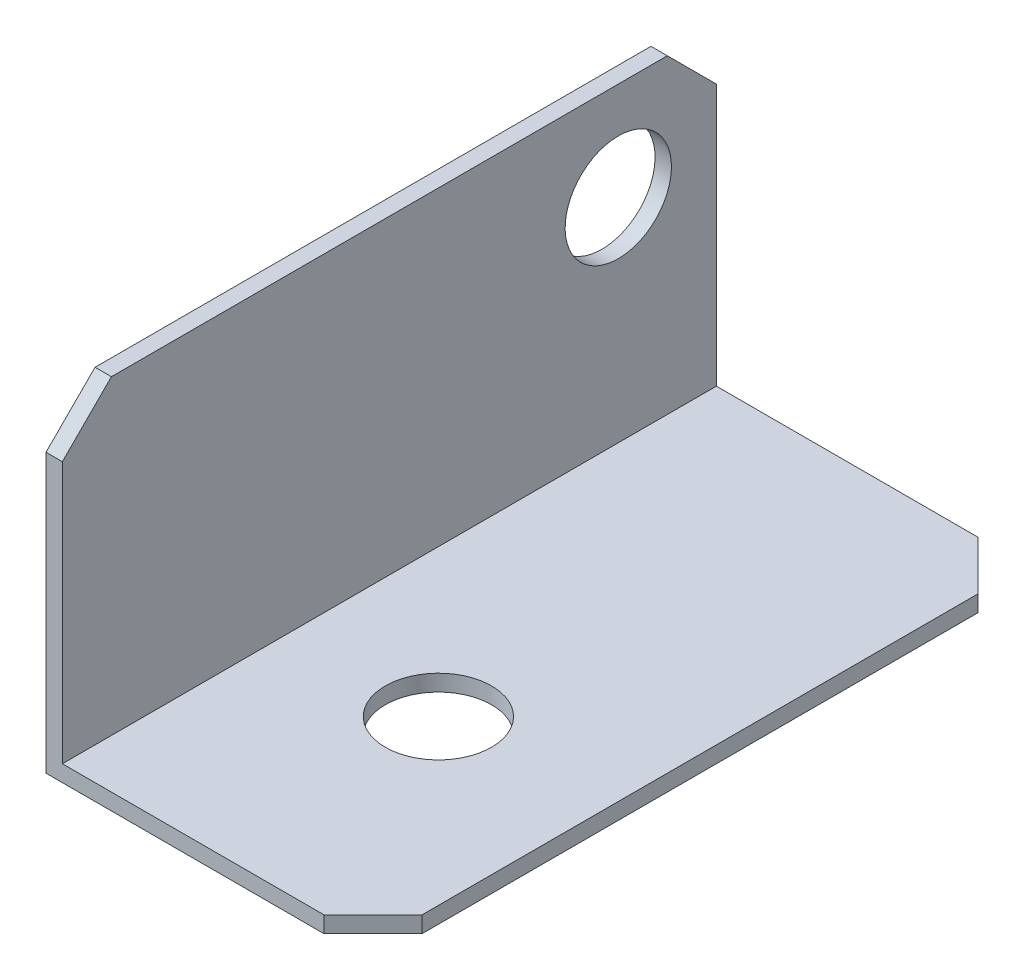
ISO-10303-21;
HEADER;
FILE_DESCRIPTION(('STEP AP214'),'2;1');
FILE_NAME('part.step','',(''),(''),'','','');
FILE_SCHEMA(('AUTOMOTIVE_DESIGN { 1 0 10303 214 1 1 1 1 }'));
ENDSEC;
DATA;
#1=APPLICATION_CONTEXT('core data for automotive mechanical design processes');
#2=APPLICATION_PROTOCOL_DEFINITION('international standard','automotive_design',2000,#1);
#3=PRODUCT_CONTEXT('',#1,'mechanical');
#4=PRODUCT('Part','Part','',(#3));
#5=PRODUCT_RELATED_PRODUCT_CATEGORY('part','',(#4));
#6=PRODUCT_DEFINITION_FORMATION('','',#4);
#7=PRODUCT_DEFINITION_CONTEXT('part definition',#1,'design');
#8=PRODUCT_DEFINITION('design','',#6,#7);
#9=PRODUCT_DEFINITION_SHAPE('','',#8);
#10=(LENGTH_UNIT() NAMED_UNIT(*) SI_UNIT(.MILLI.,.METRE.));
#11=(NAMED_UNIT(*) PLANE_ANGLE_UNIT() SI_UNIT($,.RADIAN.));
#12=(NAMED_UNIT(*) SI_UNIT($,.STERADIAN.) SOLID_ANGLE_UNIT());
#13=UNCERTAINTY_MEASURE_WITH_UNIT(LENGTH_MEASURE(1.E-05),#10,'distance_accuracy_value','');
#14=(GEOMETRIC_REPRESENTATION_CONTEXT(3) GLOBAL_UNCERTAINTY_ASSIGNED_CONTEXT((#13)) GLOBAL_UNIT_ASSIGNED_CONTEXT((#10,
#11,#12)) REPRESENTATION_CONTEXT('',''));
#15=CARTESIAN_POINT('',(0.,0.,0.));
#16=DIRECTION('',(0.,0.,1.));
#17=DIRECTION('',(1.,0.,0.));
#18=AXIS2_PLACEMENT_3D('',#15,#16,#17);
#19=CARTESIAN_POINT('',(0.,0.,20.));
#20=DIRECTION('',(0.,1.,0.));
#21=DIRECTION('',(0.,0.,1.));
#22=AXIS2_PLACEMENT_3D('',#19,#20,#21);
#23=PLANE('',#22);
#24=CARTESIAN_POINT('',(10.,0.,6.));
#25=DIRECTION('',(0.,1.,0.));
#26=DIRECTION('',(0.,0.,1.));
#27=AXIS2_PLACEMENT_3D('',#24,#25,#26);
#28=CIRCLE('',#27,3.25);
#29=CARTESIAN_POINT('',(10.,0.,9.25));
#30=VERTEX_POINT('',#29);
#31=EDGE_CURVE('E149',#30,#30,#28,.T.);
#32=ORIENTED_EDGE('',*,*,#31,.T.);
#33=EDGE_LOOP('',(#32));
#34=FACE_BOUND('',#33,.T.);
#35=DIRECTION('',(0.,0.,-1.));
#36=VECTOR('',#35,1.);
#37=CARTESIAN_POINT('',(20.,0.,20.));
#38=LINE('',#37,#36);
#39=CARTESIAN_POINT('',(20.,0.,17.));
#40=VERTEX_POINT('',#39);
#41=CARTESIAN_POINT('',(20.,0.,-17.));
#42=VERTEX_POINT('',#41);
#43=EDGE_CURVE('E161',#40,#42,#38,.T.);
#44=ORIENTED_EDGE('',*,*,#43,.F.);
#45=DIRECTION('',(-0.707106781186549,0.,0.707106781186546));
#46=VECTOR('',#45,1.);
#47=CARTESIAN_POINT('',(20.,0.,17.));
#48=LINE('',#47,#46);
#49=CARTESIAN_POINT('',(17.,0.,20.));
#50=VERTEX_POINT('',#49);
#51=EDGE_CURVE('E171',#40,#50,#48,.T.);
#52=ORIENTED_EDGE('',*,*,#51,.T.);
#53=DIRECTION('',(1.,0.,0.));
#54=VECTOR('',#53,1.);
#55=CARTESIAN_POINT('',(0.,0.,20.));
#56=LINE('',#55,#54);
#57=CARTESIAN_POINT('',(0.,0.,20.));
#58=VERTEX_POINT('',#57);
#59=EDGE_CURVE('E138',#58,#50,#56,.T.);
#60=ORIENTED_EDGE('',*,*,#59,.F.);
#61=DIRECTION('',(0.,0.,-1.));
#62=VECTOR('',#61,1.);
#63=CARTESIAN_POINT('',(0.,0.,20.));
#64=LINE('',#63,#62);
#65=CARTESIAN_POINT('',(0.,0.,-20.));
#66=VERTEX_POINT('',#65);
#67=EDGE_CURVE('E145',#58,#66,#64,.T.);
#68=ORIENTED_EDGE('',*,*,#67,.T.);
#69=DIRECTION('',(1.,0.,0.));
#70=VECTOR('',#69,1.);
#71=CARTESIAN_POINT('',(0.,0.,-20.));
#72=LINE('',#71,#70);
#73=CARTESIAN_POINT('',(17.,0.,-20.));
#74=VERTEX_POINT('',#73);
#75=EDGE_CURVE('E146',#66,#74,#72,.T.);
#76=ORIENTED_EDGE('',*,*,#75,.T.);
#77=DIRECTION('',(-0.707106781186546,0.,-0.707106781186549));
#78=VECTOR('',#77,1.);
#79=CARTESIAN_POINT('',(17.,0.,-20.));
#80=LINE('',#79,#78);
#81=EDGE_CURVE('E169',#74,#42,#80,.F.);
#82=ORIENTED_EDGE('',*,*,#81,.T.);
#83=EDGE_LOOP('',(#44,#52,#60,#68,#76,#82));
#84=FACE_BOUND('',#83,.T.);
#85=ADVANCED_FACE('F33',(#34,#84),#23,.F.);
#86=CARTESIAN_POINT('',(20.,1.,20.));
#87=DIRECTION('',(1.,0.,0.));
#88=DIRECTION('',(0.,0.,-1.));
#89=AXIS2_PLACEMENT_3D('',#86,#87,#88);
#90=PLANE('',#89);
#91=DIRECTION('',(0.,0.,-1.));
#92=VECTOR('',#91,1.);
#93=CARTESIAN_POINT('',(20.,1.,20.));
#94=LINE('',#93,#92);
#95=CARTESIAN_POINT('',(20.,1.,17.));
#96=VERTEX_POINT('',#95);
#97=CARTESIAN_POINT('',(20.,1.,-17.));
#98=VERTEX_POINT('',#97);
#99=EDGE_CURVE('E131',#96,#98,#94,.T.);
#100=ORIENTED_EDGE('',*,*,#99,.F.);
#101=DIRECTION('',(0.,-1.,0.));
#102=VECTOR('',#101,1.);
#103=CARTESIAN_POINT('',(20.,0.,17.));
#104=LINE('',#103,#102);
#105=EDGE_CURVE('E166',#96,#40,#104,.T.);
#106=ORIENTED_EDGE('',*,*,#105,.T.);
#107=ORIENTED_EDGE('',*,*,#43,.T.);
#108=DIRECTION('',(0.,1.,0.));
#109=VECTOR('',#108,1.);
#110=CARTESIAN_POINT('',(20.,1.,-17.));
#111=LINE('',#110,#109);
#112=EDGE_CURVE('E164',#42,#98,#111,.T.);
#113=ORIENTED_EDGE('',*,*,#112,.T.);
#114=EDGE_LOOP('',(#100,#106,#107,#113));
#115=FACE_BOUND('',#114,.T.);
#116=ADVANCED_FACE('F215',(#115),#90,.T.);
#117=CARTESIAN_POINT('',(0.,1.,20.));
#118=DIRECTION('',(0.,1.,0.));
#119=DIRECTION('',(0.,0.,1.));
#120=AXIS2_PLACEMENT_3D('',#117,#118,#119);
#121=PLANE('',#120);
#122=CARTESIAN_POINT('',(10.,1.,6.));
#123=DIRECTION('',(0.,1.,0.));
#124=DIRECTION('',(0.,0.,1.));
#125=AXIS2_PLACEMENT_3D('',#122,#123,#124);
#126=CIRCLE('',#125,3.25);
#127=CARTESIAN_POINT('',(10.,1.,9.25));
#128=VERTEX_POINT('',#127);
#129=EDGE_CURVE('E266',#128,#128,#126,.T.);
#130=ORIENTED_EDGE('',*,*,#129,.F.);
#131=EDGE_LOOP('',(#130));
#132=FACE_BOUND('',#131,.T.);
#133=DIRECTION('',(1.,0.,0.));
#134=VECTOR('',#133,1.);
#135=CARTESIAN_POINT('',(0.,1.,20.));
#136=LINE('',#135,#134);
#137=CARTESIAN_POINT('',(1.,1.,20.));
#138=VERTEX_POINT('',#137);
#139=CARTESIAN_POINT('',(17.,1.,20.));
#140=VERTEX_POINT('',#139);
#141=EDGE_CURVE('E123',#138,#140,#136,.T.);
#142=ORIENTED_EDGE('',*,*,#141,.T.);
#143=DIRECTION('',(0.707106781186549,0.,-0.707106781186546));
#144=VECTOR('',#143,1.);
#145=CARTESIAN_POINT('',(8.49999999999995,1.,28.5));
#146=LINE('',#145,#144);
#147=EDGE_CURVE('E178',#140,#96,#146,.T.);
#148=ORIENTED_EDGE('',*,*,#147,.T.);
#149=ORIENTED_EDGE('',*,*,#99,.T.);
#150=DIRECTION('',(0.707106781186546,0.,0.707106781186549));
#151=VECTOR('',#150,1.);
#152=CARTESIAN_POINT('',(28.5,1.,-8.49999999999991));
#153=LINE('',#152,#151);
#154=CARTESIAN_POINT('',(17.,1.,-20.));
#155=VERTEX_POINT('',#154);
#156=EDGE_CURVE('E176',#98,#155,#153,.F.);
#157=ORIENTED_EDGE('',*,*,#156,.T.);
#158=DIRECTION('',(1.,0.,0.));
#159=VECTOR('',#158,1.);
#160=CARTESIAN_POINT('',(0.,1.,-20.));
#161=LINE('',#160,#159);
#162=CARTESIAN_POINT('',(1.,1.,-20.));
#163=VERTEX_POINT('',#162);
#164=EDGE_CURVE('E130',#163,#155,#161,.T.);
#165=ORIENTED_EDGE('',*,*,#164,.F.);
#166=DIRECTION('',(0.,0.,-1.));
#167=VECTOR('',#166,1.);
#168=CARTESIAN_POINT('',(1.,1.,20.));
#169=LINE('',#168,#167);
#170=EDGE_CURVE('E115',#138,#163,#169,.T.);
#171=ORIENTED_EDGE('',*,*,#170,.F.);
#172=EDGE_LOOP('',(#142,#148,#149,#157,#165,#171));
#173=FACE_BOUND('',#172,.T.);
#174=ADVANCED_FACE('F127',(#132,#173),#121,.T.);
#175=CARTESIAN_POINT('',(0.999999999999999,20.,20.));
#176=DIRECTION('',(1.,0.,0.));
#177=DIRECTION('',(0.,1.,0.));
#178=AXIS2_PLACEMENT_3D('',#175,#176,#177);
#179=PLANE('',#178);
#180=CARTESIAN_POINT('',(0.999999999999999,14.,-14.));
#181=DIRECTION('',(1.,0.,0.));
#182=DIRECTION('',(0.,1.,0.));
#183=AXIS2_PLACEMENT_3D('',#180,#181,#182);
#184=CIRCLE('',#183,3.25);
#185=CARTESIAN_POINT('',(0.999999999999999,17.25,-14.));
#186=VERTEX_POINT('',#185);
#187=EDGE_CURVE('E263',#186,#186,#184,.T.);
#188=ORIENTED_EDGE('',*,*,#187,.F.);
#189=EDGE_LOOP('',(#188));
#190=FACE_BOUND('',#189,.T.);
#191=DIRECTION('',(0.,-1.,0.));
#192=VECTOR('',#191,1.);
#193=CARTESIAN_POINT('',(0.999999999999999,20.,-20.));
#194=LINE('',#193,#192);
#195=CARTESIAN_POINT('',(0.999999999999999,17.,-20.));
#196=VERTEX_POINT('',#195);
#197=EDGE_CURVE('E151',#196,#163,#194,.T.);
#198=ORIENTED_EDGE('',*,*,#197,.F.);
#199=DIRECTION('',(0.,-0.707106781186546,-0.707106781186549));
#200=VECTOR('',#199,1.);
#201=CARTESIAN_POINT('',(0.999999999999998,38.5,1.5000000000001));
#202=LINE('',#201,#200);
#203=CARTESIAN_POINT('',(0.999999999999999,20.,-17.));
#204=VERTEX_POINT('',#203);
#205=EDGE_CURVE('E187',#196,#204,#202,.F.);
#206=ORIENTED_EDGE('',*,*,#205,.T.);
#207=DIRECTION('',(0.,0.,-1.));
#208=VECTOR('',#207,1.);
#209=CARTESIAN_POINT('',(0.999999999999999,20.,20.));
#210=LINE('',#209,#208);
#211=CARTESIAN_POINT('',(0.999999999999999,20.,17.));
#212=VERTEX_POINT('',#211);
#213=EDGE_CURVE('E132',#212,#204,#210,.T.);
#214=ORIENTED_EDGE('',*,*,#213,.F.);
#215=DIRECTION('',(0.,-0.707106781186549,0.707106781186546));
#216=VECTOR('',#215,1.);
#217=CARTESIAN_POINT('',(0.999999999999999,18.5,18.5));
#218=LINE('',#217,#216);
#219=CARTESIAN_POINT('',(0.999999999999999,17.,20.));
#220=VERTEX_POINT('',#219);
#221=EDGE_CURVE('E118',#212,#220,#218,.T.);
#222=ORIENTED_EDGE('',*,*,#221,.T.);
#223=DIRECTION('',(0.,-1.,0.));
#224=VECTOR('',#223,1.);
#225=CARTESIAN_POINT('',(0.999999999999999,20.,20.));
#226=LINE('',#225,#224);
#227=EDGE_CURVE('E111',#220,#138,#226,.T.);
#228=ORIENTED_EDGE('',*,*,#227,.T.);
#229=ORIENTED_EDGE('',*,*,#170,.T.);
#230=EDGE_LOOP('',(#198,#206,#214,#222,#228,#229));
#231=FACE_BOUND('',#230,.T.);
#232=ADVANCED_FACE('F114',(#190,#231),#179,.T.);
#233=CARTESIAN_POINT('',(0.,20.,20.));
#234=DIRECTION('',(0.,1.,0.));
#235=DIRECTION('',(0.,0.,1.));
#236=AXIS2_PLACEMENT_3D('',#233,#234,#235);
#237=PLANE('',#236);
#238=ORIENTED_EDGE('',*,*,#213,.T.);
#239=DIRECTION('',(-1.,0.,0.));
#240=VECTOR('',#239,1.);
#241=CARTESIAN_POINT('',(0.,20.,-17.));
#242=LINE('',#241,#240);
#243=CARTESIAN_POINT('',(0.,20.,-17.));
#244=VERTEX_POINT('',#243);
#245=EDGE_CURVE('E49',#204,#244,#242,.T.);
#246=ORIENTED_EDGE('',*,*,#245,.T.);
#247=DIRECTION('',(0.,0.,-1.));
#248=VECTOR('',#247,1.);
#249=CARTESIAN_POINT('',(0.,20.,20.));
#250=LINE('',#249,#248);
#251=CARTESIAN_POINT('',(0.,20.,17.));
#252=VERTEX_POINT('',#251);
#253=EDGE_CURVE('E156',#252,#244,#250,.T.);
#254=ORIENTED_EDGE('',*,*,#253,.F.);
#255=DIRECTION('',(1.,0.,0.));
#256=VECTOR('',#255,1.);
#257=CARTESIAN_POINT('',(0.999999999999999,20.,17.));
#258=LINE('',#257,#256);
#259=EDGE_CURVE('E189',#252,#212,#258,.T.);
#260=ORIENTED_EDGE('',*,*,#259,.T.);
#261=EDGE_LOOP('',(#238,#246,#254,#260));
#262=FACE_BOUND('',#261,.T.);
#263=ADVANCED_FACE('F194',(#262),#237,.T.);
#264=CARTESIAN_POINT('',(0.,20.,20.));
#265=DIRECTION('',(1.,0.,0.));
#266=DIRECTION('',(0.,1.,0.));
#267=AXIS2_PLACEMENT_3D('',#264,#265,#266);
#268=PLANE('',#267);
#269=CARTESIAN_POINT('',(0.,14.,-14.));
#270=DIRECTION('',(1.,0.,0.));
#271=DIRECTION('',(0.,1.,0.));
#272=AXIS2_PLACEMENT_3D('',#269,#270,#271);
#273=CIRCLE('',#272,3.25);
#274=CARTESIAN_POINT('',(0.,17.25,-14.));
#275=VERTEX_POINT('',#274);
#276=EDGE_CURVE('E37',#275,#275,#273,.T.);
#277=ORIENTED_EDGE('',*,*,#276,.T.);
#278=EDGE_LOOP('',(#277));
#279=FACE_BOUND('',#278,.T.);
#280=ORIENTED_EDGE('',*,*,#253,.T.);
#281=DIRECTION('',(0.,0.707106781186546,0.707106781186549));
#282=VECTOR('',#281,1.);
#283=CARTESIAN_POINT('',(0.,17.,-20.));
#284=LINE('',#283,#282);
#285=CARTESIAN_POINT('',(0.,17.,-20.));
#286=VERTEX_POINT('',#285);
#287=EDGE_CURVE('E11',#244,#286,#284,.F.);
#288=ORIENTED_EDGE('',*,*,#287,.T.);
#289=DIRECTION('',(0.,-1.,0.));
#290=VECTOR('',#289,1.);
#291=CARTESIAN_POINT('',(0.,20.,-20.));
#292=LINE('',#291,#290);
#293=EDGE_CURVE('E140',#286,#66,#292,.T.);
#294=ORIENTED_EDGE('',*,*,#293,.T.);
#295=ORIENTED_EDGE('',*,*,#67,.F.);
#296=DIRECTION('',(0.,-1.,0.));
#297=VECTOR('',#296,1.);
#298=CARTESIAN_POINT('',(0.,20.,20.));
#299=LINE('',#298,#297);
#300=CARTESIAN_POINT('',(0.,17.,20.));
#301=VERTEX_POINT('',#300);
#302=EDGE_CURVE('E122',#301,#58,#299,.T.);
#303=ORIENTED_EDGE('',*,*,#302,.F.);
#304=DIRECTION('',(0.,0.707106781186549,-0.707106781186546));
#305=VECTOR('',#304,1.);
#306=CARTESIAN_POINT('',(0.,20.,17.));
#307=LINE('',#306,#305);
#308=EDGE_CURVE('E42',#301,#252,#307,.T.);
#309=ORIENTED_EDGE('',*,*,#308,.T.);
#310=EDGE_LOOP('',(#280,#288,#294,#295,#303,#309));
#311=FACE_BOUND('',#310,.T.);
#312=ADVANCED_FACE('F205',(#279,#311),#268,.F.);
#313=CARTESIAN_POINT('',(20.,0.,20.));
#314=DIRECTION('',(0.,0.,-1.));
#315=DIRECTION('',(-1.,0.,0.));
#316=AXIS2_PLACEMENT_3D('',#313,#314,#315);
#317=PLANE('',#316);
#318=ORIENTED_EDGE('',*,*,#59,.T.);
#319=DIRECTION('',(0.,1.,0.));
#320=VECTOR('',#319,1.);
#321=CARTESIAN_POINT('',(17.,1.,20.));
#322=LINE('',#321,#320);
#323=EDGE_CURVE('E137',#50,#140,#322,.T.);
#324=ORIENTED_EDGE('',*,*,#323,.T.);
#325=ORIENTED_EDGE('',*,*,#141,.F.);
#326=ORIENTED_EDGE('',*,*,#227,.F.);
#327=DIRECTION('',(-1.,0.,0.));
#328=VECTOR('',#327,1.);
#329=CARTESIAN_POINT('',(0.,17.,20.));
#330=LINE('',#329,#328);
#331=EDGE_CURVE('E173',#220,#301,#330,.T.);
#332=ORIENTED_EDGE('',*,*,#331,.T.);
#333=ORIENTED_EDGE('',*,*,#302,.T.);
#334=EDGE_LOOP('',(#318,#324,#325,#326,#332,#333));
#335=FACE_BOUND('',#334,.T.);
#336=ADVANCED_FACE('F135',(#335),#317,.F.);
#337=CARTESIAN_POINT('',(20.,0.,-20.));
#338=DIRECTION('',(0.,0.,-1.));
#339=DIRECTION('',(-1.,0.,0.));
#340=AXIS2_PLACEMENT_3D('',#337,#338,#339);
#341=PLANE('',#340);
#342=ORIENTED_EDGE('',*,*,#164,.T.);
#343=DIRECTION('',(0.,-1.,0.));
#344=VECTOR('',#343,1.);
#345=CARTESIAN_POINT('',(17.,0.,-20.));
#346=LINE('',#345,#344);
#347=EDGE_CURVE('E183',#155,#74,#346,.T.);
#348=ORIENTED_EDGE('',*,*,#347,.T.);
#349=ORIENTED_EDGE('',*,*,#75,.F.);
#350=ORIENTED_EDGE('',*,*,#293,.F.);
#351=DIRECTION('',(1.,0.,0.));
#352=VECTOR('',#351,1.);
#353=CARTESIAN_POINT('',(20.,17.,-20.));
#354=LINE('',#353,#352);
#355=EDGE_CURVE('E180',#286,#196,#354,.T.);
#356=ORIENTED_EDGE('',*,*,#355,.T.);
#357=ORIENTED_EDGE('',*,*,#197,.T.);
#358=EDGE_LOOP('',(#342,#348,#349,#350,#356,#357));
#359=FACE_BOUND('',#358,.T.);
#360=ADVANCED_FACE('F202',(#359),#341,.T.);
#361=CARTESIAN_POINT('',(20.,1.,17.));
#362=DIRECTION('',(0.707106781186546,0.,0.707106781186549));
#363=DIRECTION('',(0.707106781186549,0.,-0.707106781186546));
#364=AXIS2_PLACEMENT_3D('',#361,#362,#363);
#365=PLANE('',#364);
#366=ORIENTED_EDGE('',*,*,#147,.F.);
#367=ORIENTED_EDGE('',*,*,#323,.F.);
#368=ORIENTED_EDGE('',*,*,#51,.F.);
#369=ORIENTED_EDGE('',*,*,#105,.F.);
#370=EDGE_LOOP('',(#366,#367,#368,#369));
#371=FACE_BOUND('',#370,.T.);
#372=ADVANCED_FACE('F210',(#371),#365,.T.);
#373=CARTESIAN_POINT('',(17.,0.,-20.));
#374=DIRECTION('',(-0.707106781186549,0.,0.707106781186546));
#375=DIRECTION('',(0.707106781186546,0.,0.707106781186549));
#376=AXIS2_PLACEMENT_3D('',#373,#374,#375);
#377=PLANE('',#376);
#378=ORIENTED_EDGE('',*,*,#156,.F.);
#379=ORIENTED_EDGE('',*,*,#112,.F.);
#380=ORIENTED_EDGE('',*,*,#81,.F.);
#381=ORIENTED_EDGE('',*,*,#347,.F.);
#382=EDGE_LOOP('',(#378,#379,#380,#381));
#383=FACE_BOUND('',#382,.T.);
#384=ADVANCED_FACE('F218',(#383),#377,.F.);
#385=CARTESIAN_POINT('',(20.,17.,-20.));
#386=DIRECTION('',(0.,-0.707106781186549,0.707106781186546));
#387=DIRECTION('',(0.,-0.707106781186546,-0.707106781186549));
#388=AXIS2_PLACEMENT_3D('',#385,#386,#387);
#389=PLANE('',#388);
#390=ORIENTED_EDGE('',*,*,#287,.F.);
#391=ORIENTED_EDGE('',*,*,#245,.F.);
#392=ORIENTED_EDGE('',*,*,#205,.F.);
#393=ORIENTED_EDGE('',*,*,#355,.F.);
#394=EDGE_LOOP('',(#390,#391,#392,#393));
#395=FACE_BOUND('',#394,.T.);
#396=ADVANCED_FACE('F199',(#395),#389,.F.);
#397=CARTESIAN_POINT('',(0.,20.,17.));
#398=DIRECTION('',(0.,0.707106781186546,0.707106781186549));
#399=DIRECTION('',(0.,-0.707106781186549,0.707106781186546));
#400=AXIS2_PLACEMENT_3D('',#397,#398,#399);
#401=PLANE('',#400);
#402=ORIENTED_EDGE('',*,*,#308,.F.);
#403=ORIENTED_EDGE('',*,*,#331,.F.);
#404=ORIENTED_EDGE('',*,*,#221,.F.);
#405=ORIENTED_EDGE('',*,*,#259,.F.);
#406=EDGE_LOOP('',(#402,#403,#404,#405));
#407=FACE_BOUND('',#406,.T.);
#408=ADVANCED_FACE('F35',(#407),#401,.T.);
#409=CARTESIAN_POINT('',(10.,-9.,6.));
#410=DIRECTION('',(0.,1.,0.));
#411=DIRECTION('',(0.,0.,1.));
#412=AXIS2_PLACEMENT_3D('',#409,#410,#411);
#413=CYLINDRICAL_SURFACE('',#412,3.25);
#414=ORIENTED_EDGE('',*,*,#129,.T.);
#415=EDGE_LOOP('',(#414));
#416=FACE_BOUND('',#415,.T.);
#417=ORIENTED_EDGE('',*,*,#31,.F.);
#418=EDGE_LOOP('',(#417));
#419=FACE_BOUND('',#418,.T.);
#420=ADVANCED_FACE('F251',(#416,#419),#413,.F.);
#421=CARTESIAN_POINT('',(-9.,14.,-14.));
#422=DIRECTION('',(1.,0.,0.));
#423=DIRECTION('',(0.,1.,0.));
#424=AXIS2_PLACEMENT_3D('',#421,#422,#423);
#425=CYLINDRICAL_SURFACE('',#424,3.25);
#426=ORIENTED_EDGE('',*,*,#187,.T.);
#427=EDGE_LOOP('',(#426));
#428=FACE_BOUND('',#427,.T.);
#429=ORIENTED_EDGE('',*,*,#276,.F.);
#430=EDGE_LOOP('',(#429));
#431=FACE_BOUND('',#430,.T.);
#432=ADVANCED_FACE('F254',(#428,#431),#425,.F.);
#433=CLOSED_SHELL('',(#85,#116,#174,#232,#263,#312,#336,#360,#372,#384,#396,#408,#420,#432));
#434=MANIFOLD_SOLID_BREP('B2',#433);
#435=ADVANCED_BREP_SHAPE_REPRESENTATION('',(#18,#434),#14);
#436=SHAPE_DEFINITION_REPRESENTATION(#9,#435);
ENDSEC;
END-ISO-10303-21;
